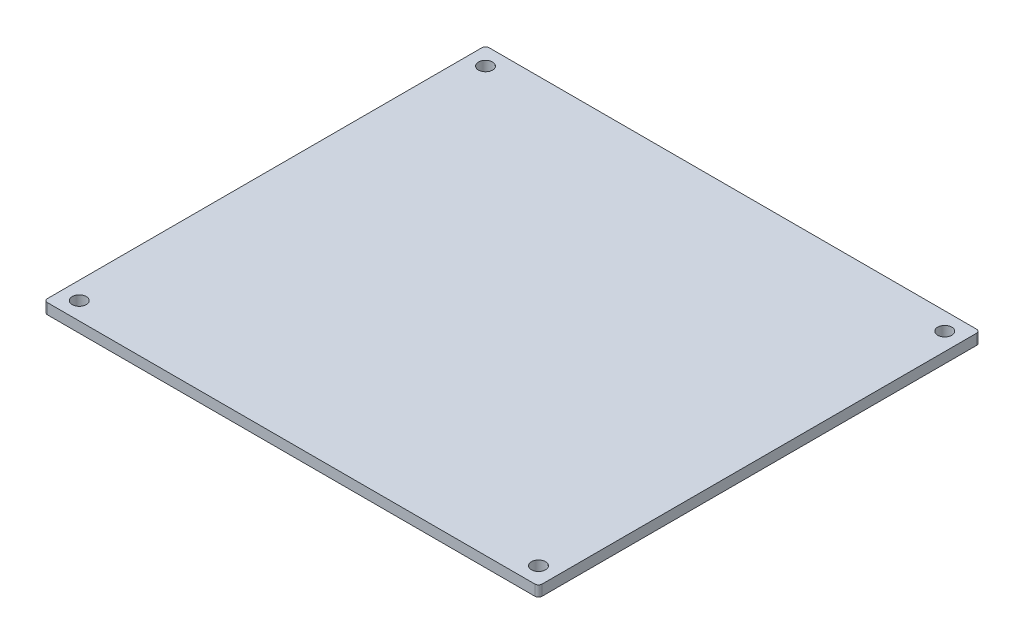
ISO-10303-21;
HEADER;
FILE_DESCRIPTION(('STEP AP214'),'2;1');
FILE_NAME('part.step','',(''),(''),'','','');
FILE_SCHEMA(('AUTOMOTIVE_DESIGN { 1 0 10303 214 1 1 1 1 }'));
ENDSEC;
DATA;
#1=APPLICATION_CONTEXT('core data for automotive mechanical design processes');
#2=APPLICATION_PROTOCOL_DEFINITION('international standard','automotive_design',2000,#1);
#3=PRODUCT_CONTEXT('',#1,'mechanical');
#4=PRODUCT('Part','Part','',(#3));
#5=PRODUCT_RELATED_PRODUCT_CATEGORY('part','',(#4));
#6=PRODUCT_DEFINITION_FORMATION('','',#4);
#7=PRODUCT_DEFINITION_CONTEXT('part definition',#1,'design');
#8=PRODUCT_DEFINITION('design','',#6,#7);
#9=PRODUCT_DEFINITION_SHAPE('','',#8);
#10=(LENGTH_UNIT() NAMED_UNIT(*) SI_UNIT(.MILLI.,.METRE.));
#11=(NAMED_UNIT(*) PLANE_ANGLE_UNIT() SI_UNIT($,.RADIAN.));
#12=(NAMED_UNIT(*) SI_UNIT($,.STERADIAN.) SOLID_ANGLE_UNIT());
#13=UNCERTAINTY_MEASURE_WITH_UNIT(LENGTH_MEASURE(1.E-05),#10,'distance_accuracy_value','');
#14=(GEOMETRIC_REPRESENTATION_CONTEXT(3) GLOBAL_UNCERTAINTY_ASSIGNED_CONTEXT((#13)) GLOBAL_UNIT_ASSIGNED_CONTEXT((#10,
#11,#12)) REPRESENTATION_CONTEXT('',''));
#15=CARTESIAN_POINT('',(0.,0.,0.));
#16=DIRECTION('',(0.,0.,1.));
#17=DIRECTION('',(1.,0.,0.));
#18=AXIS2_PLACEMENT_3D('',#15,#16,#17);
#19=CARTESIAN_POINT('',(140.,6.,-125.));
#20=DIRECTION('',(0.,0.,1.));
#21=DIRECTION('',(1.,0.,0.));
#22=AXIS2_PLACEMENT_3D('',#19,#20,#21);
#23=PLANE('',#22);
#24=DIRECTION('',(-1.,0.,0.));
#25=VECTOR('',#24,1.);
#26=CARTESIAN_POINT('',(140.,0.,-125.));
#27=LINE('',#26,#25);
#28=CARTESIAN_POINT('',(138.,0.,-125.));
#29=VERTEX_POINT('',#28);
#30=CARTESIAN_POINT('',(-138.,0.,-125.));
#31=VERTEX_POINT('',#30);
#32=EDGE_CURVE('E135',#29,#31,#27,.T.);
#33=ORIENTED_EDGE('',*,*,#32,.T.);
#34=DIRECTION('',(0.,-1.,0.));
#35=VECTOR('',#34,1.);
#36=CARTESIAN_POINT('',(-138.,6.,-125.));
#37=LINE('',#36,#35);
#38=CARTESIAN_POINT('',(-138.,6.,-125.));
#39=VERTEX_POINT('',#38);
#40=EDGE_CURVE('E110',#31,#39,#37,.F.);
#41=ORIENTED_EDGE('',*,*,#40,.T.);
#42=DIRECTION('',(-1.,0.,0.));
#43=VECTOR('',#42,1.);
#44=CARTESIAN_POINT('',(140.,6.,-125.));
#45=LINE('',#44,#43);
#46=CARTESIAN_POINT('',(138.,6.,-125.));
#47=VERTEX_POINT('',#46);
#48=EDGE_CURVE('E148',#47,#39,#45,.T.);
#49=ORIENTED_EDGE('',*,*,#48,.F.);
#50=DIRECTION('',(0.,-1.,0.));
#51=VECTOR('',#50,1.);
#52=CARTESIAN_POINT('',(138.,6.,-125.));
#53=LINE('',#52,#51);
#54=EDGE_CURVE('E116',#47,#29,#53,.T.);
#55=ORIENTED_EDGE('',*,*,#54,.T.);
#56=EDGE_LOOP('',(#33,#41,#49,#55));
#57=FACE_BOUND('',#56,.T.);
#58=ADVANCED_FACE('F39',(#57),#23,.F.);
#59=CARTESIAN_POINT('',(-140.,6.,-125.));
#60=DIRECTION('',(1.,0.,0.));
#61=DIRECTION('',(0.,0.,-1.));
#62=AXIS2_PLACEMENT_3D('',#59,#60,#61);
#63=PLANE('',#62);
#64=DIRECTION('',(0.,0.,1.));
#65=VECTOR('',#64,1.);
#66=CARTESIAN_POINT('',(-140.,6.,-125.));
#67=LINE('',#66,#65);
#68=CARTESIAN_POINT('',(-140.,6.,-123.));
#69=VERTEX_POINT('',#68);
#70=CARTESIAN_POINT('',(-140.,6.,123.));
#71=VERTEX_POINT('',#70);
#72=EDGE_CURVE('E126',#69,#71,#67,.T.);
#73=ORIENTED_EDGE('',*,*,#72,.F.);
#74=DIRECTION('',(0.,-1.,0.));
#75=VECTOR('',#74,1.);
#76=CARTESIAN_POINT('',(-140.,6.,-123.));
#77=LINE('',#76,#75);
#78=CARTESIAN_POINT('',(-140.,0.,-123.));
#79=VERTEX_POINT('',#78);
#80=EDGE_CURVE('E109',#69,#79,#77,.T.);
#81=ORIENTED_EDGE('',*,*,#80,.T.);
#82=DIRECTION('',(0.,0.,1.));
#83=VECTOR('',#82,1.);
#84=CARTESIAN_POINT('',(-140.,0.,-125.));
#85=LINE('',#84,#83);
#86=CARTESIAN_POINT('',(-140.,0.,123.));
#87=VERTEX_POINT('',#86);
#88=EDGE_CURVE('E123',#79,#87,#85,.T.);
#89=ORIENTED_EDGE('',*,*,#88,.T.);
#90=DIRECTION('',(0.,-1.,0.));
#91=VECTOR('',#90,1.);
#92=CARTESIAN_POINT('',(-140.,6.,123.));
#93=LINE('',#92,#91);
#94=EDGE_CURVE('E129',#87,#71,#93,.F.);
#95=ORIENTED_EDGE('',*,*,#94,.T.);
#96=EDGE_LOOP('',(#73,#81,#89,#95));
#97=FACE_BOUND('',#96,.T.);
#98=ADVANCED_FACE('F122',(#97),#63,.F.);
#99=CARTESIAN_POINT('',(-140.,6.,125.));
#100=DIRECTION('',(0.,0.,-1.));
#101=DIRECTION('',(-1.,0.,0.));
#102=AXIS2_PLACEMENT_3D('',#99,#100,#101);
#103=PLANE('',#102);
#104=DIRECTION('',(1.,0.,0.));
#105=VECTOR('',#104,1.);
#106=CARTESIAN_POINT('',(-140.,6.,125.));
#107=LINE('',#106,#105);
#108=CARTESIAN_POINT('',(-138.,6.,125.));
#109=VERTEX_POINT('',#108);
#110=CARTESIAN_POINT('',(138.,6.,125.));
#111=VERTEX_POINT('',#110);
#112=EDGE_CURVE('E197',#109,#111,#107,.T.);
#113=ORIENTED_EDGE('',*,*,#112,.F.);
#114=DIRECTION('',(0.,-1.,0.));
#115=VECTOR('',#114,1.);
#116=CARTESIAN_POINT('',(-138.,6.,125.));
#117=LINE('',#116,#115);
#118=CARTESIAN_POINT('',(-138.,0.,125.));
#119=VERTEX_POINT('',#118);
#120=EDGE_CURVE('E178',#109,#119,#117,.T.);
#121=ORIENTED_EDGE('',*,*,#120,.T.);
#122=DIRECTION('',(1.,0.,0.));
#123=VECTOR('',#122,1.);
#124=CARTESIAN_POINT('',(-140.,0.,125.));
#125=LINE('',#124,#123);
#126=CARTESIAN_POINT('',(138.,0.,125.));
#127=VERTEX_POINT('',#126);
#128=EDGE_CURVE('E134',#119,#127,#125,.T.);
#129=ORIENTED_EDGE('',*,*,#128,.T.);
#130=DIRECTION('',(0.,-1.,0.));
#131=VECTOR('',#130,1.);
#132=CARTESIAN_POINT('',(138.,6.,125.));
#133=LINE('',#132,#131);
#134=EDGE_CURVE('E175',#127,#111,#133,.F.);
#135=ORIENTED_EDGE('',*,*,#134,.T.);
#136=EDGE_LOOP('',(#113,#121,#129,#135));
#137=FACE_BOUND('',#136,.T.);
#138=ADVANCED_FACE('F215',(#137),#103,.F.);
#139=CARTESIAN_POINT('',(140.,6.,125.));
#140=DIRECTION('',(-1.,0.,0.));
#141=DIRECTION('',(0.,0.,1.));
#142=AXIS2_PLACEMENT_3D('',#139,#140,#141);
#143=PLANE('',#142);
#144=DIRECTION('',(0.,0.,-1.));
#145=VECTOR('',#144,1.);
#146=CARTESIAN_POINT('',(140.,0.,125.));
#147=LINE('',#146,#145);
#148=CARTESIAN_POINT('',(140.,0.,123.));
#149=VERTEX_POINT('',#148);
#150=CARTESIAN_POINT('',(140.,0.,-123.));
#151=VERTEX_POINT('',#150);
#152=EDGE_CURVE('E140',#149,#151,#147,.T.);
#153=ORIENTED_EDGE('',*,*,#152,.T.);
#154=DIRECTION('',(0.,-1.,0.));
#155=VECTOR('',#154,1.);
#156=CARTESIAN_POINT('',(140.,6.,-123.));
#157=LINE('',#156,#155);
#158=CARTESIAN_POINT('',(140.,6.,-123.));
#159=VERTEX_POINT('',#158);
#160=EDGE_CURVE('E11',#151,#159,#157,.F.);
#161=ORIENTED_EDGE('',*,*,#160,.T.);
#162=DIRECTION('',(0.,0.,-1.));
#163=VECTOR('',#162,1.);
#164=CARTESIAN_POINT('',(140.,6.,125.));
#165=LINE('',#164,#163);
#166=CARTESIAN_POINT('',(140.,6.,123.));
#167=VERTEX_POINT('',#166);
#168=EDGE_CURVE('E150',#167,#159,#165,.T.);
#169=ORIENTED_EDGE('',*,*,#168,.F.);
#170=DIRECTION('',(0.,-1.,0.));
#171=VECTOR('',#170,1.);
#172=CARTESIAN_POINT('',(140.,6.,123.));
#173=LINE('',#172,#171);
#174=EDGE_CURVE('E48',#167,#149,#173,.T.);
#175=ORIENTED_EDGE('',*,*,#174,.T.);
#176=EDGE_LOOP('',(#153,#161,#169,#175));
#177=FACE_BOUND('',#176,.T.);
#178=ADVANCED_FACE('F185',(#177),#143,.F.);
#179=CARTESIAN_POINT('',(0.,6.,0.));
#180=DIRECTION('',(0.,1.,0.));
#181=DIRECTION('',(0.,0.,1.));
#182=AXIS2_PLACEMENT_3D('',#179,#180,#181);
#183=PLANE('',#182);
#184=CARTESIAN_POINT('',(-130.,6.,115.));
#185=DIRECTION('',(0.,1.,0.));
#186=DIRECTION('',(0.,0.,1.));
#187=AXIS2_PLACEMENT_3D('',#184,#185,#186);
#188=CIRCLE('',#187,3.99999999999999);
#189=CARTESIAN_POINT('',(-130.,6.,119.));
#190=VERTEX_POINT('',#189);
#191=EDGE_CURVE('E331',#190,#190,#188,.T.);
#192=ORIENTED_EDGE('',*,*,#191,.F.);
#193=EDGE_LOOP('',(#192));
#194=FACE_BOUND('',#193,.T.);
#195=CARTESIAN_POINT('',(130.,6.,115.));
#196=DIRECTION('',(0.,1.,0.));
#197=DIRECTION('',(0.,0.,1.));
#198=AXIS2_PLACEMENT_3D('',#195,#196,#197);
#199=CIRCLE('',#198,3.99999999999999);
#200=CARTESIAN_POINT('',(130.,6.,119.));
#201=VERTEX_POINT('',#200);
#202=EDGE_CURVE('E335',#201,#201,#199,.T.);
#203=ORIENTED_EDGE('',*,*,#202,.F.);
#204=EDGE_LOOP('',(#203));
#205=FACE_BOUND('',#204,.T.);
#206=CARTESIAN_POINT('',(130.,6.,-115.));
#207=DIRECTION('',(0.,1.,0.));
#208=DIRECTION('',(0.,0.,1.));
#209=AXIS2_PLACEMENT_3D('',#206,#207,#208);
#210=CIRCLE('',#209,3.99999999999999);
#211=CARTESIAN_POINT('',(130.,6.,-111.));
#212=VERTEX_POINT('',#211);
#213=EDGE_CURVE('E349',#212,#212,#210,.T.);
#214=ORIENTED_EDGE('',*,*,#213,.F.);
#215=EDGE_LOOP('',(#214));
#216=FACE_BOUND('',#215,.T.);
#217=CARTESIAN_POINT('',(-130.,6.,-115.));
#218=DIRECTION('',(0.,1.,0.));
#219=DIRECTION('',(0.,0.,1.));
#220=AXIS2_PLACEMENT_3D('',#217,#218,#219);
#221=CIRCLE('',#220,3.99999999999999);
#222=CARTESIAN_POINT('',(-130.,6.,-111.));
#223=VERTEX_POINT('',#222);
#224=EDGE_CURVE('E200',#223,#223,#221,.T.);
#225=ORIENTED_EDGE('',*,*,#224,.F.);
#226=EDGE_LOOP('',(#225));
#227=FACE_BOUND('',#226,.T.);
#228=ORIENTED_EDGE('',*,*,#48,.T.);
#229=CARTESIAN_POINT('',(-138.,6.,-123.));
#230=DIRECTION('',(0.,1.,0.));
#231=DIRECTION('',(0.,0.,1.));
#232=AXIS2_PLACEMENT_3D('',#229,#230,#231);
#233=CIRCLE('',#232,2.);
#234=EDGE_CURVE('E172',#39,#69,#233,.T.);
#235=ORIENTED_EDGE('',*,*,#234,.T.);
#236=ORIENTED_EDGE('',*,*,#72,.T.);
#237=CARTESIAN_POINT('',(-138.,6.,123.));
#238=DIRECTION('',(0.,1.,0.));
#239=DIRECTION('',(0.,0.,1.));
#240=AXIS2_PLACEMENT_3D('',#237,#238,#239);
#241=CIRCLE('',#240,2.);
#242=EDGE_CURVE('E169',#71,#109,#241,.T.);
#243=ORIENTED_EDGE('',*,*,#242,.T.);
#244=ORIENTED_EDGE('',*,*,#112,.T.);
#245=CARTESIAN_POINT('',(138.,6.,123.));
#246=DIRECTION('',(0.,1.,0.));
#247=DIRECTION('',(0.,0.,1.));
#248=AXIS2_PLACEMENT_3D('',#245,#246,#247);
#249=CIRCLE('',#248,2.);
#250=EDGE_CURVE('E60',#111,#167,#249,.T.);
#251=ORIENTED_EDGE('',*,*,#250,.T.);
#252=ORIENTED_EDGE('',*,*,#168,.T.);
#253=CARTESIAN_POINT('',(138.,6.,-123.));
#254=DIRECTION('',(0.,1.,0.));
#255=DIRECTION('',(0.,0.,1.));
#256=AXIS2_PLACEMENT_3D('',#253,#254,#255);
#257=CIRCLE('',#256,2.);
#258=EDGE_CURVE('E166',#159,#47,#257,.T.);
#259=ORIENTED_EDGE('',*,*,#258,.T.);
#260=EDGE_LOOP('',(#228,#235,#236,#243,#244,#251,#252,#259));
#261=FACE_BOUND('',#260,.T.);
#262=ADVANCED_FACE('F205',(#194,#205,#216,#227,#261),#183,.T.);
#263=CARTESIAN_POINT('',(0.,0.,0.));
#264=DIRECTION('',(0.,1.,0.));
#265=DIRECTION('',(0.,0.,1.));
#266=AXIS2_PLACEMENT_3D('',#263,#264,#265);
#267=PLANE('',#266);
#268=CARTESIAN_POINT('',(-130.,0.,115.));
#269=DIRECTION('',(0.,1.,0.));
#270=DIRECTION('',(0.,0.,1.));
#271=AXIS2_PLACEMENT_3D('',#268,#269,#270);
#272=CIRCLE('',#271,3.99999999999999);
#273=CARTESIAN_POINT('',(-130.,0.,119.));
#274=VERTEX_POINT('',#273);
#275=EDGE_CURVE('E329',#274,#274,#272,.T.);
#276=ORIENTED_EDGE('',*,*,#275,.T.);
#277=EDGE_LOOP('',(#276));
#278=FACE_BOUND('',#277,.T.);
#279=CARTESIAN_POINT('',(130.,0.,115.));
#280=DIRECTION('',(0.,1.,0.));
#281=DIRECTION('',(0.,0.,1.));
#282=AXIS2_PLACEMENT_3D('',#279,#280,#281);
#283=CIRCLE('',#282,3.99999999999999);
#284=CARTESIAN_POINT('',(130.,0.,119.));
#285=VERTEX_POINT('',#284);
#286=EDGE_CURVE('E355',#285,#285,#283,.T.);
#287=ORIENTED_EDGE('',*,*,#286,.T.);
#288=EDGE_LOOP('',(#287));
#289=FACE_BOUND('',#288,.T.);
#290=CARTESIAN_POINT('',(130.,0.,-115.));
#291=DIRECTION('',(0.,1.,0.));
#292=DIRECTION('',(0.,0.,1.));
#293=AXIS2_PLACEMENT_3D('',#290,#291,#292);
#294=CIRCLE('',#293,3.99999999999999);
#295=CARTESIAN_POINT('',(130.,0.,-111.));
#296=VERTEX_POINT('',#295);
#297=EDGE_CURVE('E344',#296,#296,#294,.T.);
#298=ORIENTED_EDGE('',*,*,#297,.T.);
#299=EDGE_LOOP('',(#298));
#300=FACE_BOUND('',#299,.T.);
#301=CARTESIAN_POINT('',(-130.,0.,-115.));
#302=DIRECTION('',(0.,1.,0.));
#303=DIRECTION('',(0.,0.,1.));
#304=AXIS2_PLACEMENT_3D('',#301,#302,#303);
#305=CIRCLE('',#304,3.99999999999999);
#306=CARTESIAN_POINT('',(-130.,0.,-111.));
#307=VERTEX_POINT('',#306);
#308=EDGE_CURVE('E142',#307,#307,#305,.T.);
#309=ORIENTED_EDGE('',*,*,#308,.T.);
#310=EDGE_LOOP('',(#309));
#311=FACE_BOUND('',#310,.T.);
#312=ORIENTED_EDGE('',*,*,#88,.F.);
#313=CARTESIAN_POINT('',(-138.,0.,-123.));
#314=DIRECTION('',(0.,1.,0.));
#315=DIRECTION('',(0.,0.,1.));
#316=AXIS2_PLACEMENT_3D('',#313,#314,#315);
#317=CIRCLE('',#316,2.);
#318=EDGE_CURVE('E105',#79,#31,#317,.F.);
#319=ORIENTED_EDGE('',*,*,#318,.T.);
#320=ORIENTED_EDGE('',*,*,#32,.F.);
#321=CARTESIAN_POINT('',(138.,0.,-123.));
#322=DIRECTION('',(0.,1.,0.));
#323=DIRECTION('',(0.,0.,1.));
#324=AXIS2_PLACEMENT_3D('',#321,#322,#323);
#325=CIRCLE('',#324,2.);
#326=EDGE_CURVE('E154',#29,#151,#325,.F.);
#327=ORIENTED_EDGE('',*,*,#326,.T.);
#328=ORIENTED_EDGE('',*,*,#152,.F.);
#329=CARTESIAN_POINT('',(138.,0.,123.));
#330=DIRECTION('',(0.,1.,0.));
#331=DIRECTION('',(0.,0.,1.));
#332=AXIS2_PLACEMENT_3D('',#329,#330,#331);
#333=CIRCLE('',#332,2.);
#334=EDGE_CURVE('E128',#149,#127,#333,.F.);
#335=ORIENTED_EDGE('',*,*,#334,.T.);
#336=ORIENTED_EDGE('',*,*,#128,.F.);
#337=CARTESIAN_POINT('',(-138.,0.,123.));
#338=DIRECTION('',(0.,1.,0.));
#339=DIRECTION('',(0.,0.,1.));
#340=AXIS2_PLACEMENT_3D('',#337,#338,#339);
#341=CIRCLE('',#340,2.);
#342=EDGE_CURVE('E117',#119,#87,#341,.F.);
#343=ORIENTED_EDGE('',*,*,#342,.T.);
#344=EDGE_LOOP('',(#312,#319,#320,#327,#328,#335,#336,#343));
#345=FACE_BOUND('',#344,.T.);
#346=ADVANCED_FACE('F131',(#278,#289,#300,#311,#345),#267,.F.);
#347=CARTESIAN_POINT('',(-138.,6.,-123.));
#348=DIRECTION('',(0.,-1.,0.));
#349=DIRECTION('',(0.,0.,-1.));
#350=AXIS2_PLACEMENT_3D('',#347,#348,#349);
#351=CYLINDRICAL_SURFACE('',#350,2.);
#352=ORIENTED_EDGE('',*,*,#234,.F.);
#353=ORIENTED_EDGE('',*,*,#40,.F.);
#354=ORIENTED_EDGE('',*,*,#318,.F.);
#355=ORIENTED_EDGE('',*,*,#80,.F.);
#356=EDGE_LOOP('',(#352,#353,#354,#355));
#357=FACE_BOUND('',#356,.T.);
#358=ADVANCED_FACE('F108',(#357),#351,.T.);
#359=CARTESIAN_POINT('',(-138.,6.,123.));
#360=DIRECTION('',(0.,-1.,0.));
#361=DIRECTION('',(0.,0.,-1.));
#362=AXIS2_PLACEMENT_3D('',#359,#360,#361);
#363=CYLINDRICAL_SURFACE('',#362,2.);
#364=ORIENTED_EDGE('',*,*,#242,.F.);
#365=ORIENTED_EDGE('',*,*,#94,.F.);
#366=ORIENTED_EDGE('',*,*,#342,.F.);
#367=ORIENTED_EDGE('',*,*,#120,.F.);
#368=EDGE_LOOP('',(#364,#365,#366,#367));
#369=FACE_BOUND('',#368,.T.);
#370=ADVANCED_FACE('F230',(#369),#363,.T.);
#371=CARTESIAN_POINT('',(138.,6.,-123.));
#372=DIRECTION('',(0.,-1.,0.));
#373=DIRECTION('',(0.,0.,-1.));
#374=AXIS2_PLACEMENT_3D('',#371,#372,#373);
#375=CYLINDRICAL_SURFACE('',#374,2.);
#376=ORIENTED_EDGE('',*,*,#258,.F.);
#377=ORIENTED_EDGE('',*,*,#160,.F.);
#378=ORIENTED_EDGE('',*,*,#326,.F.);
#379=ORIENTED_EDGE('',*,*,#54,.F.);
#380=EDGE_LOOP('',(#376,#377,#378,#379));
#381=FACE_BOUND('',#380,.T.);
#382=ADVANCED_FACE('F190',(#381),#375,.T.);
#383=CARTESIAN_POINT('',(138.,6.,123.));
#384=DIRECTION('',(0.,-1.,0.));
#385=DIRECTION('',(0.,0.,-1.));
#386=AXIS2_PLACEMENT_3D('',#383,#384,#385);
#387=CYLINDRICAL_SURFACE('',#386,2.);
#388=ORIENTED_EDGE('',*,*,#250,.F.);
#389=ORIENTED_EDGE('',*,*,#134,.F.);
#390=ORIENTED_EDGE('',*,*,#334,.F.);
#391=ORIENTED_EDGE('',*,*,#174,.F.);
#392=EDGE_LOOP('',(#388,#389,#390,#391));
#393=FACE_BOUND('',#392,.T.);
#394=ADVANCED_FACE('F41',(#393),#387,.T.);
#395=CARTESIAN_POINT('',(-130.,0.,-115.));
#396=DIRECTION('',(0.,1.,0.));
#397=DIRECTION('',(0.,0.,1.));
#398=AXIS2_PLACEMENT_3D('',#395,#396,#397);
#399=CYLINDRICAL_SURFACE('',#398,3.99999999999999);
#400=ORIENTED_EDGE('',*,*,#308,.F.);
#401=EDGE_LOOP('',(#400));
#402=FACE_BOUND('',#401,.T.);
#403=ORIENTED_EDGE('',*,*,#224,.T.);
#404=EDGE_LOOP('',(#403));
#405=FACE_BOUND('',#404,.T.);
#406=ADVANCED_FACE('F237',(#402,#405),#399,.F.);
#407=CARTESIAN_POINT('',(130.,0.,-115.));
#408=DIRECTION('',(0.,1.,0.));
#409=DIRECTION('',(0.,0.,1.));
#410=AXIS2_PLACEMENT_3D('',#407,#408,#409);
#411=CYLINDRICAL_SURFACE('',#410,3.99999999999999);
#412=ORIENTED_EDGE('',*,*,#297,.F.);
#413=EDGE_LOOP('',(#412));
#414=FACE_BOUND('',#413,.T.);
#415=ORIENTED_EDGE('',*,*,#213,.T.);
#416=EDGE_LOOP('',(#415));
#417=FACE_BOUND('',#416,.T.);
#418=ADVANCED_FACE('F241',(#414,#417),#411,.F.);
#419=CARTESIAN_POINT('',(130.,0.,115.));
#420=DIRECTION('',(0.,1.,0.));
#421=DIRECTION('',(0.,0.,1.));
#422=AXIS2_PLACEMENT_3D('',#419,#420,#421);
#423=CYLINDRICAL_SURFACE('',#422,3.99999999999999);
#424=ORIENTED_EDGE('',*,*,#286,.F.);
#425=EDGE_LOOP('',(#424));
#426=FACE_BOUND('',#425,.T.);
#427=ORIENTED_EDGE('',*,*,#202,.T.);
#428=EDGE_LOOP('',(#427));
#429=FACE_BOUND('',#428,.T.);
#430=ADVANCED_FACE('F302',(#426,#429),#423,.F.);
#431=CARTESIAN_POINT('',(-130.,0.,115.));
#432=DIRECTION('',(0.,1.,0.));
#433=DIRECTION('',(0.,0.,1.));
#434=AXIS2_PLACEMENT_3D('',#431,#432,#433);
#435=CYLINDRICAL_SURFACE('',#434,3.99999999999999);
#436=ORIENTED_EDGE('',*,*,#275,.F.);
#437=EDGE_LOOP('',(#436));
#438=FACE_BOUND('',#437,.T.);
#439=ORIENTED_EDGE('',*,*,#191,.T.);
#440=EDGE_LOOP('',(#439));
#441=FACE_BOUND('',#440,.T.);
#442=ADVANCED_FACE('F312',(#438,#441),#435,.F.);
#443=CLOSED_SHELL('',(#58,#98,#138,#178,#262,#346,#358,#370,#382,#394,#406,#418,#430,#442));
#444=MANIFOLD_SOLID_BREP('B2',#443);
#445=ADVANCED_BREP_SHAPE_REPRESENTATION('',(#18,#444),#14);
#446=SHAPE_DEFINITION_REPRESENTATION(#9,#445);
ENDSEC;
END-ISO-10303-21;
